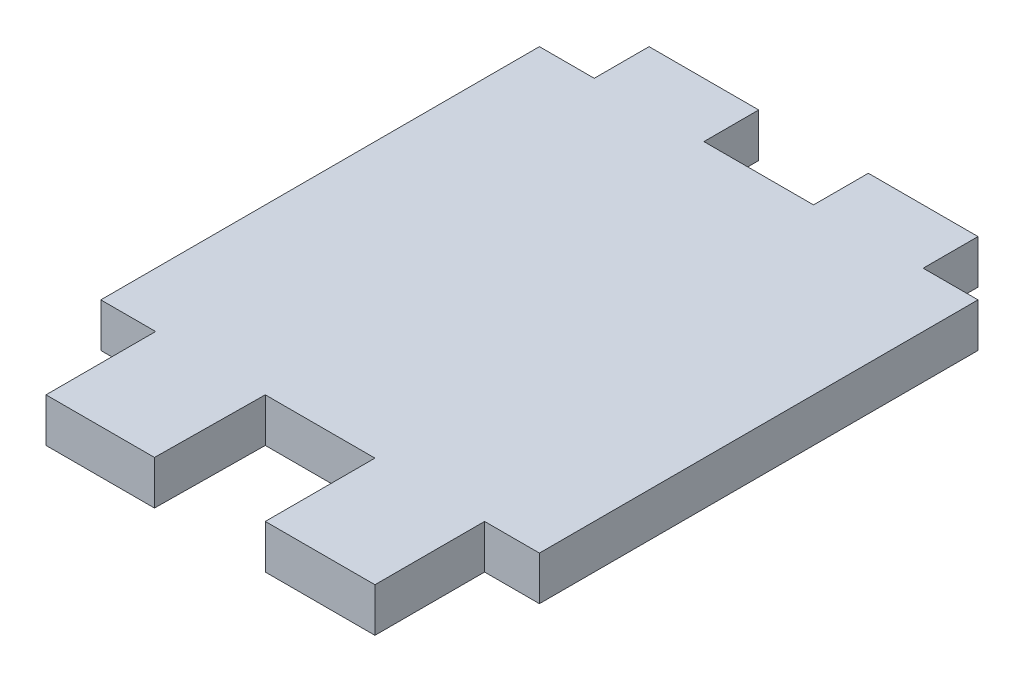
ISO-10303-21;
HEADER;
FILE_DESCRIPTION(('STEP AP214'),'2;1');
FILE_NAME('part.step','',(''),(''),'','','');
FILE_SCHEMA(('AUTOMOTIVE_DESIGN { 1 0 10303 214 1 1 1 1 }'));
ENDSEC;
DATA;
#1=APPLICATION_CONTEXT('core data for automotive mechanical design processes');
#2=APPLICATION_PROTOCOL_DEFINITION('international standard','automotive_design',2000,#1);
#3=PRODUCT_CONTEXT('',#1,'mechanical');
#4=PRODUCT('Part','Part','',(#3));
#5=PRODUCT_RELATED_PRODUCT_CATEGORY('part','',(#4));
#6=PRODUCT_DEFINITION_FORMATION('','',#4);
#7=PRODUCT_DEFINITION_CONTEXT('part definition',#1,'design');
#8=PRODUCT_DEFINITION('design','',#6,#7);
#9=PRODUCT_DEFINITION_SHAPE('','',#8);
#10=(LENGTH_UNIT() NAMED_UNIT(*) SI_UNIT(.MILLI.,.METRE.));
#11=(NAMED_UNIT(*) PLANE_ANGLE_UNIT() SI_UNIT($,.RADIAN.));
#12=(NAMED_UNIT(*) SI_UNIT($,.STERADIAN.) SOLID_ANGLE_UNIT());
#13=UNCERTAINTY_MEASURE_WITH_UNIT(LENGTH_MEASURE(1.E-05),#10,'distance_accuracy_value','');
#14=(GEOMETRIC_REPRESENTATION_CONTEXT(3) GLOBAL_UNCERTAINTY_ASSIGNED_CONTEXT((#13)) GLOBAL_UNIT_ASSIGNED_CONTEXT((#10,
#11,#12)) REPRESENTATION_CONTEXT('',''));
#15=CARTESIAN_POINT('',(0.,0.,0.));
#16=DIRECTION('',(0.,0.,1.));
#17=DIRECTION('',(1.,0.,0.));
#18=AXIS2_PLACEMENT_3D('',#15,#16,#17);
#19=CARTESIAN_POINT('',(0.533091410652587,4.,-30.5410125973874));
#20=DIRECTION('',(0.,0.,1.));
#21=DIRECTION('',(1.,0.,0.));
#22=AXIS2_PLACEMENT_3D('',#19,#20,#21);
#23=PLANE('',#22);
#24=DIRECTION('',(-1.,0.,0.));
#25=VECTOR('',#24,1.);
#26=CARTESIAN_POINT('',(0.533091410652587,0.,-30.5410125973874));
#27=LINE('',#26,#25);
#28=CARTESIAN_POINT('',(5.53309141065259,0.,-30.5410125973874));
#29=VERTEX_POINT('',#28);
#30=CARTESIAN_POINT('',(0.533091410652587,0.,-30.5410125973874));
#31=VERTEX_POINT('',#30);
#32=EDGE_CURVE('E200',#29,#31,#27,.T.);
#33=ORIENTED_EDGE('',*,*,#32,.T.);
#34=DIRECTION('',(0.,-1.,0.));
#35=VECTOR('',#34,1.);
#36=CARTESIAN_POINT('',(0.533091410652587,4.,-30.5410125973874));
#37=LINE('',#36,#35);
#38=CARTESIAN_POINT('',(0.533091410652587,4.,-30.5410125973874));
#39=VERTEX_POINT('',#38);
#40=EDGE_CURVE('E11',#39,#31,#37,.T.);
#41=ORIENTED_EDGE('',*,*,#40,.F.);
#42=DIRECTION('',(-1.,0.,0.));
#43=VECTOR('',#42,1.);
#44=CARTESIAN_POINT('',(0.533091410652587,4.,-30.5410125973874));
#45=LINE('',#44,#43);
#46=CARTESIAN_POINT('',(5.53309141065259,4.,-30.5410125973874));
#47=VERTEX_POINT('',#46);
#48=EDGE_CURVE('E238',#47,#39,#45,.T.);
#49=ORIENTED_EDGE('',*,*,#48,.F.);
#50=DIRECTION('',(0.,-1.,0.));
#51=VECTOR('',#50,1.);
#52=CARTESIAN_POINT('',(5.53309141065259,4.,-30.5410125973874));
#53=LINE('',#52,#51);
#54=EDGE_CURVE('E196',#47,#29,#53,.T.);
#55=ORIENTED_EDGE('',*,*,#54,.T.);
#56=EDGE_LOOP('',(#33,#41,#49,#55));
#57=FACE_BOUND('',#56,.T.);
#58=ADVANCED_FACE('F32',(#57),#23,.F.);
#59=CARTESIAN_POINT('',(0.533091410652587,4.,-30.5410125973874));
#60=DIRECTION('',(-1.,0.,0.));
#61=DIRECTION('',(0.,0.,1.));
#62=AXIS2_PLACEMENT_3D('',#59,#60,#61);
#63=PLANE('',#62);
#64=DIRECTION('',(0.,0.,-1.));
#65=VECTOR('',#64,1.);
#66=CARTESIAN_POINT('',(0.533091410652587,0.,-30.5410125973874));
#67=LINE('',#66,#65);
#68=CARTESIAN_POINT('',(0.533091410652587,0.,-35.5410125973874));
#69=VERTEX_POINT('',#68);
#70=EDGE_CURVE('E203',#31,#69,#67,.T.);
#71=ORIENTED_EDGE('',*,*,#70,.T.);
#72=DIRECTION('',(0.,-1.,0.));
#73=VECTOR('',#72,1.);
#74=CARTESIAN_POINT('',(0.533091410652587,4.,-35.5410125973874));
#75=LINE('',#74,#73);
#76=CARTESIAN_POINT('',(0.533091410652587,4.,-35.5410125973874));
#77=VERTEX_POINT('',#76);
#78=EDGE_CURVE('E40',#77,#69,#75,.T.);
#79=ORIENTED_EDGE('',*,*,#78,.F.);
#80=DIRECTION('',(0.,0.,-1.));
#81=VECTOR('',#80,1.);
#82=CARTESIAN_POINT('',(0.533091410652587,4.,-30.5410125973874));
#83=LINE('',#82,#81);
#84=EDGE_CURVE('E127',#39,#77,#83,.T.);
#85=ORIENTED_EDGE('',*,*,#84,.F.);
#86=ORIENTED_EDGE('',*,*,#40,.T.);
#87=EDGE_LOOP('',(#71,#79,#85,#86));
#88=FACE_BOUND('',#87,.T.);
#89=ADVANCED_FACE('F356',(#88),#63,.F.);
#90=CARTESIAN_POINT('',(0.533091410652587,4.,-35.5410125973874));
#91=DIRECTION('',(0.,0.,1.));
#92=DIRECTION('',(1.,0.,0.));
#93=AXIS2_PLACEMENT_3D('',#90,#91,#92);
#94=PLANE('',#93);
#95=DIRECTION('',(-1.,0.,0.));
#96=VECTOR('',#95,1.);
#97=CARTESIAN_POINT('',(0.533091410652587,0.,-35.5410125973874));
#98=LINE('',#97,#96);
#99=CARTESIAN_POINT('',(-9.46690858934741,0.,-35.5410125973874));
#100=VERTEX_POINT('',#99);
#101=EDGE_CURVE('E205',#69,#100,#98,.T.);
#102=ORIENTED_EDGE('',*,*,#101,.T.);
#103=DIRECTION('',(0.,-1.,0.));
#104=VECTOR('',#103,1.);
#105=CARTESIAN_POINT('',(-9.46690858934741,4.,-35.5410125973874));
#106=LINE('',#105,#104);
#107=CARTESIAN_POINT('',(-9.46690858934741,4.,-35.5410125973874));
#108=VERTEX_POINT('',#107);
#109=EDGE_CURVE('E281',#108,#100,#106,.T.);
#110=ORIENTED_EDGE('',*,*,#109,.F.);
#111=DIRECTION('',(-1.,0.,0.));
#112=VECTOR('',#111,1.);
#113=CARTESIAN_POINT('',(0.533091410652587,4.,-35.5410125973874));
#114=LINE('',#113,#112);
#115=EDGE_CURVE('E289',#77,#108,#114,.T.);
#116=ORIENTED_EDGE('',*,*,#115,.F.);
#117=ORIENTED_EDGE('',*,*,#78,.T.);
#118=EDGE_LOOP('',(#102,#110,#116,#117));
#119=FACE_BOUND('',#118,.T.);
#120=ADVANCED_FACE('F287',(#119),#94,.F.);
#121=CARTESIAN_POINT('',(-9.46690858934741,4.,-35.5410125973874));
#122=DIRECTION('',(1.,0.,0.));
#123=DIRECTION('',(0.,0.,-1.));
#124=AXIS2_PLACEMENT_3D('',#121,#122,#123);
#125=PLANE('',#124);
#126=DIRECTION('',(0.,0.,1.));
#127=VECTOR('',#126,1.);
#128=CARTESIAN_POINT('',(-9.46690858934741,0.,-35.5410125973874));
#129=LINE('',#128,#127);
#130=CARTESIAN_POINT('',(-9.46690858934741,0.,-30.5410125973874));
#131=VERTEX_POINT('',#130);
#132=EDGE_CURVE('E207',#100,#131,#129,.T.);
#133=ORIENTED_EDGE('',*,*,#132,.T.);
#134=DIRECTION('',(0.,-1.,0.));
#135=VECTOR('',#134,1.);
#136=CARTESIAN_POINT('',(-9.46690858934741,4.,-30.5410125973874));
#137=LINE('',#136,#135);
#138=CARTESIAN_POINT('',(-9.46690858934741,4.,-30.5410125973874));
#139=VERTEX_POINT('',#138);
#140=EDGE_CURVE('E278',#139,#131,#137,.T.);
#141=ORIENTED_EDGE('',*,*,#140,.F.);
#142=DIRECTION('',(0.,0.,1.));
#143=VECTOR('',#142,1.);
#144=CARTESIAN_POINT('',(-9.46690858934741,4.,-35.5410125973874));
#145=LINE('',#144,#143);
#146=EDGE_CURVE('E307',#108,#139,#145,.T.);
#147=ORIENTED_EDGE('',*,*,#146,.F.);
#148=ORIENTED_EDGE('',*,*,#109,.T.);
#149=EDGE_LOOP('',(#133,#141,#147,#148));
#150=FACE_BOUND('',#149,.T.);
#151=ADVANCED_FACE('F298',(#150),#125,.F.);
#152=CARTESIAN_POINT('',(-9.46690858934741,4.,-30.5410125973874));
#153=DIRECTION('',(0.,0.,1.));
#154=DIRECTION('',(1.,0.,0.));
#155=AXIS2_PLACEMENT_3D('',#152,#153,#154);
#156=PLANE('',#155);
#157=DIRECTION('',(-1.,0.,0.));
#158=VECTOR('',#157,1.);
#159=CARTESIAN_POINT('',(-9.46690858934741,0.,-30.5410125973874));
#160=LINE('',#159,#158);
#161=CARTESIAN_POINT('',(-19.4669085893474,0.,-30.5410125973874));
#162=VERTEX_POINT('',#161);
#163=EDGE_CURVE('E209',#131,#162,#160,.T.);
#164=ORIENTED_EDGE('',*,*,#163,.T.);
#165=DIRECTION('',(0.,-1.,0.));
#166=VECTOR('',#165,1.);
#167=CARTESIAN_POINT('',(-19.4669085893474,4.,-30.5410125973874));
#168=LINE('',#167,#166);
#169=CARTESIAN_POINT('',(-19.4669085893474,4.,-30.5410125973874));
#170=VERTEX_POINT('',#169);
#171=EDGE_CURVE('E275',#170,#162,#168,.T.);
#172=ORIENTED_EDGE('',*,*,#171,.F.);
#173=DIRECTION('',(-1.,0.,0.));
#174=VECTOR('',#173,1.);
#175=CARTESIAN_POINT('',(-9.46690858934741,4.,-30.5410125973874));
#176=LINE('',#175,#174);
#177=EDGE_CURVE('E304',#139,#170,#176,.T.);
#178=ORIENTED_EDGE('',*,*,#177,.F.);
#179=ORIENTED_EDGE('',*,*,#140,.T.);
#180=EDGE_LOOP('',(#164,#172,#178,#179));
#181=FACE_BOUND('',#180,.T.);
#182=ADVANCED_FACE('F302',(#181),#156,.F.);
#183=CARTESIAN_POINT('',(-19.4669085893474,4.,-30.5410125973874));
#184=DIRECTION('',(-1.,0.,0.));
#185=DIRECTION('',(0.,0.,1.));
#186=AXIS2_PLACEMENT_3D('',#183,#184,#185);
#187=PLANE('',#186);
#188=DIRECTION('',(0.,0.,-1.));
#189=VECTOR('',#188,1.);
#190=CARTESIAN_POINT('',(-19.4669085893474,0.,-30.5410125973874));
#191=LINE('',#190,#189);
#192=CARTESIAN_POINT('',(-19.4669085893474,0.,-35.5410125973874));
#193=VERTEX_POINT('',#192);
#194=EDGE_CURVE('E211',#162,#193,#191,.T.);
#195=ORIENTED_EDGE('',*,*,#194,.T.);
#196=DIRECTION('',(0.,-1.,0.));
#197=VECTOR('',#196,1.);
#198=CARTESIAN_POINT('',(-19.4669085893474,4.,-35.5410125973874));
#199=LINE('',#198,#197);
#200=CARTESIAN_POINT('',(-19.4669085893474,4.,-35.5410125973874));
#201=VERTEX_POINT('',#200);
#202=EDGE_CURVE('E272',#201,#193,#199,.T.);
#203=ORIENTED_EDGE('',*,*,#202,.F.);
#204=DIRECTION('',(0.,0.,-1.));
#205=VECTOR('',#204,1.);
#206=CARTESIAN_POINT('',(-19.4669085893474,4.,-30.5410125973874));
#207=LINE('',#206,#205);
#208=EDGE_CURVE('E306',#170,#201,#207,.T.);
#209=ORIENTED_EDGE('',*,*,#208,.F.);
#210=ORIENTED_EDGE('',*,*,#171,.T.);
#211=EDGE_LOOP('',(#195,#203,#209,#210));
#212=FACE_BOUND('',#211,.T.);
#213=ADVANCED_FACE('F369',(#212),#187,.F.);
#214=CARTESIAN_POINT('',(-19.4669085893474,4.,-35.5410125973874));
#215=DIRECTION('',(0.,0.,1.));
#216=DIRECTION('',(1.,0.,0.));
#217=AXIS2_PLACEMENT_3D('',#214,#215,#216);
#218=PLANE('',#217);
#219=DIRECTION('',(-1.,0.,0.));
#220=VECTOR('',#219,1.);
#221=CARTESIAN_POINT('',(-19.4669085893474,0.,-35.5410125973874));
#222=LINE('',#221,#220);
#223=CARTESIAN_POINT('',(-29.4669085893474,0.,-35.5410125973874));
#224=VERTEX_POINT('',#223);
#225=EDGE_CURVE('E213',#193,#224,#222,.T.);
#226=ORIENTED_EDGE('',*,*,#225,.T.);
#227=DIRECTION('',(0.,-1.,0.));
#228=VECTOR('',#227,1.);
#229=CARTESIAN_POINT('',(-29.4669085893474,4.,-35.5410125973874));
#230=LINE('',#229,#228);
#231=CARTESIAN_POINT('',(-29.4669085893474,4.,-35.5410125973874));
#232=VERTEX_POINT('',#231);
#233=EDGE_CURVE('E269',#232,#224,#230,.T.);
#234=ORIENTED_EDGE('',*,*,#233,.F.);
#235=DIRECTION('',(-1.,0.,0.));
#236=VECTOR('',#235,1.);
#237=CARTESIAN_POINT('',(-19.4669085893474,4.,-35.5410125973874));
#238=LINE('',#237,#236);
#239=EDGE_CURVE('E309',#201,#232,#238,.T.);
#240=ORIENTED_EDGE('',*,*,#239,.F.);
#241=ORIENTED_EDGE('',*,*,#202,.T.);
#242=EDGE_LOOP('',(#226,#234,#240,#241));
#243=FACE_BOUND('',#242,.T.);
#244=ADVANCED_FACE('F372',(#243),#218,.F.);
#245=CARTESIAN_POINT('',(-29.4669085893474,4.,-35.5410125973874));
#246=DIRECTION('',(1.,0.,0.));
#247=DIRECTION('',(0.,0.,-1.));
#248=AXIS2_PLACEMENT_3D('',#245,#246,#247);
#249=PLANE('',#248);
#250=DIRECTION('',(0.,0.,1.));
#251=VECTOR('',#250,1.);
#252=CARTESIAN_POINT('',(-29.4669085893474,0.,-35.5410125973874));
#253=LINE('',#252,#251);
#254=CARTESIAN_POINT('',(-29.4669085893474,0.,-30.5410125973874));
#255=VERTEX_POINT('',#254);
#256=EDGE_CURVE('E215',#224,#255,#253,.T.);
#257=ORIENTED_EDGE('',*,*,#256,.T.);
#258=DIRECTION('',(0.,-1.,0.));
#259=VECTOR('',#258,1.);
#260=CARTESIAN_POINT('',(-29.4669085893474,4.,-30.5410125973874));
#261=LINE('',#260,#259);
#262=CARTESIAN_POINT('',(-29.4669085893474,4.,-30.5410125973874));
#263=VERTEX_POINT('',#262);
#264=EDGE_CURVE('E266',#263,#255,#261,.T.);
#265=ORIENTED_EDGE('',*,*,#264,.F.);
#266=DIRECTION('',(0.,0.,1.));
#267=VECTOR('',#266,1.);
#268=CARTESIAN_POINT('',(-29.4669085893474,4.,-35.5410125973874));
#269=LINE('',#268,#267);
#270=EDGE_CURVE('E315',#232,#263,#269,.T.);
#271=ORIENTED_EDGE('',*,*,#270,.F.);
#272=ORIENTED_EDGE('',*,*,#233,.T.);
#273=EDGE_LOOP('',(#257,#265,#271,#272));
#274=FACE_BOUND('',#273,.T.);
#275=ADVANCED_FACE('F376',(#274),#249,.F.);
#276=CARTESIAN_POINT('',(-29.4669085893474,4.,-30.5410125973874));
#277=DIRECTION('',(0.,0.,1.));
#278=DIRECTION('',(1.,0.,0.));
#279=AXIS2_PLACEMENT_3D('',#276,#277,#278);
#280=PLANE('',#279);
#281=DIRECTION('',(-1.,0.,0.));
#282=VECTOR('',#281,1.);
#283=CARTESIAN_POINT('',(-29.4669085893474,0.,-30.5410125973874));
#284=LINE('',#283,#282);
#285=CARTESIAN_POINT('',(-34.4669085893474,0.,-30.5410125973874));
#286=VERTEX_POINT('',#285);
#287=EDGE_CURVE('E217',#255,#286,#284,.T.);
#288=ORIENTED_EDGE('',*,*,#287,.T.);
#289=DIRECTION('',(0.,-1.,0.));
#290=VECTOR('',#289,1.);
#291=CARTESIAN_POINT('',(-34.4669085893474,4.,-30.5410125973874));
#292=LINE('',#291,#290);
#293=CARTESIAN_POINT('',(-34.4669085893474,4.,-30.5410125973874));
#294=VERTEX_POINT('',#293);
#295=EDGE_CURVE('E263',#294,#286,#292,.T.);
#296=ORIENTED_EDGE('',*,*,#295,.F.);
#297=DIRECTION('',(-1.,0.,0.));
#298=VECTOR('',#297,1.);
#299=CARTESIAN_POINT('',(-29.4669085893474,4.,-30.5410125973874));
#300=LINE('',#299,#298);
#301=EDGE_CURVE('E317',#263,#294,#300,.T.);
#302=ORIENTED_EDGE('',*,*,#301,.F.);
#303=ORIENTED_EDGE('',*,*,#264,.T.);
#304=EDGE_LOOP('',(#288,#296,#302,#303));
#305=FACE_BOUND('',#304,.T.);
#306=ADVANCED_FACE('F380',(#305),#280,.F.);
#307=CARTESIAN_POINT('',(-34.4669085893474,4.,-30.5410125973874));
#308=DIRECTION('',(1.,0.,0.));
#309=DIRECTION('',(0.,0.,-1.));
#310=AXIS2_PLACEMENT_3D('',#307,#308,#309);
#311=PLANE('',#310);
#312=DIRECTION('',(0.,0.,1.));
#313=VECTOR('',#312,1.);
#314=CARTESIAN_POINT('',(-34.4669085893474,0.,-30.5410125973874));
#315=LINE('',#314,#313);
#316=CARTESIAN_POINT('',(-34.4669085893474,0.,9.45898740261258));
#317=VERTEX_POINT('',#316);
#318=EDGE_CURVE('E219',#286,#317,#315,.T.);
#319=ORIENTED_EDGE('',*,*,#318,.T.);
#320=DIRECTION('',(0.,-1.,0.));
#321=VECTOR('',#320,1.);
#322=CARTESIAN_POINT('',(-34.4669085893474,4.,9.45898740261258));
#323=LINE('',#322,#321);
#324=CARTESIAN_POINT('',(-34.4669085893474,4.,9.45898740261258));
#325=VERTEX_POINT('',#324);
#326=EDGE_CURVE('E260',#325,#317,#323,.T.);
#327=ORIENTED_EDGE('',*,*,#326,.F.);
#328=DIRECTION('',(0.,0.,1.));
#329=VECTOR('',#328,1.);
#330=CARTESIAN_POINT('',(-34.4669085893474,4.,-30.5410125973874));
#331=LINE('',#330,#329);
#332=EDGE_CURVE('E319',#294,#325,#331,.T.);
#333=ORIENTED_EDGE('',*,*,#332,.F.);
#334=ORIENTED_EDGE('',*,*,#295,.T.);
#335=EDGE_LOOP('',(#319,#327,#333,#334));
#336=FACE_BOUND('',#335,.T.);
#337=ADVANCED_FACE('F384',(#336),#311,.F.);
#338=CARTESIAN_POINT('',(-29.4669085893474,4.,9.45898740261258));
#339=DIRECTION('',(0.,0.,-1.));
#340=DIRECTION('',(-1.,0.,0.));
#341=AXIS2_PLACEMENT_3D('',#338,#339,#340);
#342=PLANE('',#341);
#343=DIRECTION('',(1.,0.,0.));
#344=VECTOR('',#343,1.);
#345=CARTESIAN_POINT('',(-29.4669085893474,0.,9.45898740261258));
#346=LINE('',#345,#344);
#347=CARTESIAN_POINT('',(-29.4669085893474,0.,9.45898740261258));
#348=VERTEX_POINT('',#347);
#349=EDGE_CURVE('E221',#317,#348,#346,.T.);
#350=ORIENTED_EDGE('',*,*,#349,.T.);
#351=DIRECTION('',(0.,-1.,0.));
#352=VECTOR('',#351,1.);
#353=CARTESIAN_POINT('',(-29.4669085893474,4.,9.45898740261258));
#354=LINE('',#353,#352);
#355=CARTESIAN_POINT('',(-29.4669085893474,4.,9.45898740261258));
#356=VERTEX_POINT('',#355);
#357=EDGE_CURVE('E257',#356,#348,#354,.T.);
#358=ORIENTED_EDGE('',*,*,#357,.F.);
#359=DIRECTION('',(1.,0.,0.));
#360=VECTOR('',#359,1.);
#361=CARTESIAN_POINT('',(-29.4669085893474,4.,9.45898740261258));
#362=LINE('',#361,#360);
#363=EDGE_CURVE('E321',#325,#356,#362,.T.);
#364=ORIENTED_EDGE('',*,*,#363,.F.);
#365=ORIENTED_EDGE('',*,*,#326,.T.);
#366=EDGE_LOOP('',(#350,#358,#364,#365));
#367=FACE_BOUND('',#366,.T.);
#368=ADVANCED_FACE('F388',(#367),#342,.F.);
#369=CARTESIAN_POINT('',(-29.4669085893474,4.,19.4589874026126));
#370=DIRECTION('',(1.,0.,0.));
#371=DIRECTION('',(0.,0.,-1.));
#372=AXIS2_PLACEMENT_3D('',#369,#370,#371);
#373=PLANE('',#372);
#374=DIRECTION('',(0.,0.,1.));
#375=VECTOR('',#374,1.);
#376=CARTESIAN_POINT('',(-29.4669085893474,0.,19.4589874026126));
#377=LINE('',#376,#375);
#378=CARTESIAN_POINT('',(-29.4669085893474,0.,19.4589874026126));
#379=VERTEX_POINT('',#378);
#380=EDGE_CURVE('E223',#348,#379,#377,.T.);
#381=ORIENTED_EDGE('',*,*,#380,.T.);
#382=DIRECTION('',(0.,-1.,0.));
#383=VECTOR('',#382,1.);
#384=CARTESIAN_POINT('',(-29.4669085893474,4.,19.4589874026126));
#385=LINE('',#384,#383);
#386=CARTESIAN_POINT('',(-29.4669085893474,4.,19.4589874026126));
#387=VERTEX_POINT('',#386);
#388=EDGE_CURVE('E254',#387,#379,#385,.T.);
#389=ORIENTED_EDGE('',*,*,#388,.F.);
#390=DIRECTION('',(0.,0.,1.));
#391=VECTOR('',#390,1.);
#392=CARTESIAN_POINT('',(-29.4669085893474,4.,19.4589874026126));
#393=LINE('',#392,#391);
#394=EDGE_CURVE('E323',#356,#387,#393,.T.);
#395=ORIENTED_EDGE('',*,*,#394,.F.);
#396=ORIENTED_EDGE('',*,*,#357,.T.);
#397=EDGE_LOOP('',(#381,#389,#395,#396));
#398=FACE_BOUND('',#397,.T.);
#399=ADVANCED_FACE('F392',(#398),#373,.F.);
#400=CARTESIAN_POINT('',(-19.5742645583764,4.,19.4589874026126));
#401=DIRECTION('',(0.,0.,-1.));
#402=DIRECTION('',(-1.,0.,0.));
#403=AXIS2_PLACEMENT_3D('',#400,#401,#402);
#404=PLANE('',#403);
#405=DIRECTION('',(1.,0.,0.));
#406=VECTOR('',#405,1.);
#407=CARTESIAN_POINT('',(-19.5742645583764,0.,19.4589874026126));
#408=LINE('',#407,#406);
#409=CARTESIAN_POINT('',(-19.5742645583764,0.,19.4589874026126));
#410=VERTEX_POINT('',#409);
#411=EDGE_CURVE('E225',#379,#410,#408,.T.);
#412=ORIENTED_EDGE('',*,*,#411,.T.);
#413=DIRECTION('',(0.,-1.,0.));
#414=VECTOR('',#413,1.);
#415=CARTESIAN_POINT('',(-19.5742645583764,4.,19.4589874026126));
#416=LINE('',#415,#414);
#417=CARTESIAN_POINT('',(-19.5742645583764,4.,19.4589874026126));
#418=VERTEX_POINT('',#417);
#419=EDGE_CURVE('E251',#418,#410,#416,.T.);
#420=ORIENTED_EDGE('',*,*,#419,.F.);
#421=DIRECTION('',(1.,0.,0.));
#422=VECTOR('',#421,1.);
#423=CARTESIAN_POINT('',(-19.5742645583764,4.,19.4589874026126));
#424=LINE('',#423,#422);
#425=EDGE_CURVE('E325',#387,#418,#424,.T.);
#426=ORIENTED_EDGE('',*,*,#425,.F.);
#427=ORIENTED_EDGE('',*,*,#388,.T.);
#428=EDGE_LOOP('',(#412,#420,#426,#427));
#429=FACE_BOUND('',#428,.T.);
#430=ADVANCED_FACE('F396',(#429),#404,.F.);
#431=CARTESIAN_POINT('',(-19.4669085893474,4.,9.45898740261259));
#432=DIRECTION('',(-0.999942378460315,0.,-0.0107349783012724));
#433=DIRECTION('',(-0.0107349783012724,0.,0.999942378460315));
#434=AXIS2_PLACEMENT_3D('',#431,#432,#433);
#435=PLANE('',#434);
#436=DIRECTION('',(0.0107349783012724,0.,-0.999942378460315));
#437=VECTOR('',#436,1.);
#438=CARTESIAN_POINT('',(-19.4669085893474,0.,9.45898740261259));
#439=LINE('',#438,#437);
#440=CARTESIAN_POINT('',(-19.4669085893474,0.,9.45898740261259));
#441=VERTEX_POINT('',#440);
#442=EDGE_CURVE('E227',#410,#441,#439,.T.);
#443=ORIENTED_EDGE('',*,*,#442,.T.);
#444=DIRECTION('',(0.,-1.,0.));
#445=VECTOR('',#444,1.);
#446=CARTESIAN_POINT('',(-19.4669085893474,4.,9.45898740261259));
#447=LINE('',#446,#445);
#448=CARTESIAN_POINT('',(-19.4669085893474,4.,9.45898740261259));
#449=VERTEX_POINT('',#448);
#450=EDGE_CURVE('E248',#449,#441,#447,.T.);
#451=ORIENTED_EDGE('',*,*,#450,.F.);
#452=DIRECTION('',(0.0107349783012724,0.,-0.999942378460315));
#453=VECTOR('',#452,1.);
#454=CARTESIAN_POINT('',(-19.4669085893474,4.,9.45898740261259));
#455=LINE('',#454,#453);
#456=EDGE_CURVE('E327',#418,#449,#455,.T.);
#457=ORIENTED_EDGE('',*,*,#456,.F.);
#458=ORIENTED_EDGE('',*,*,#419,.T.);
#459=EDGE_LOOP('',(#443,#451,#457,#458));
#460=FACE_BOUND('',#459,.T.);
#461=ADVANCED_FACE('F400',(#460),#435,.F.);
#462=CARTESIAN_POINT('',(-9.46690858934741,4.,9.45898740261259));
#463=DIRECTION('',(0.,0.,-1.));
#464=DIRECTION('',(-1.,0.,0.));
#465=AXIS2_PLACEMENT_3D('',#462,#463,#464);
#466=PLANE('',#465);
#467=DIRECTION('',(1.,0.,0.));
#468=VECTOR('',#467,1.);
#469=CARTESIAN_POINT('',(-9.46690858934741,0.,9.45898740261259));
#470=LINE('',#469,#468);
#471=CARTESIAN_POINT('',(-9.46690858934741,0.,9.45898740261259));
#472=VERTEX_POINT('',#471);
#473=EDGE_CURVE('E229',#441,#472,#470,.T.);
#474=ORIENTED_EDGE('',*,*,#473,.T.);
#475=DIRECTION('',(0.,-1.,0.));
#476=VECTOR('',#475,1.);
#477=CARTESIAN_POINT('',(-9.46690858934741,4.,9.45898740261259));
#478=LINE('',#477,#476);
#479=CARTESIAN_POINT('',(-9.46690858934741,4.,9.45898740261259));
#480=VERTEX_POINT('',#479);
#481=EDGE_CURVE('E245',#480,#472,#478,.T.);
#482=ORIENTED_EDGE('',*,*,#481,.F.);
#483=DIRECTION('',(1.,0.,0.));
#484=VECTOR('',#483,1.);
#485=CARTESIAN_POINT('',(-9.46690858934741,4.,9.45898740261259));
#486=LINE('',#485,#484);
#487=EDGE_CURVE('E329',#449,#480,#486,.T.);
#488=ORIENTED_EDGE('',*,*,#487,.F.);
#489=ORIENTED_EDGE('',*,*,#450,.T.);
#490=EDGE_LOOP('',(#474,#482,#488,#489));
#491=FACE_BOUND('',#490,.T.);
#492=ADVANCED_FACE('F404',(#491),#466,.F.);
#493=CARTESIAN_POINT('',(-9.46690858934741,4.,19.4589874026126));
#494=DIRECTION('',(1.,0.,0.));
#495=DIRECTION('',(0.,0.,-1.));
#496=AXIS2_PLACEMENT_3D('',#493,#494,#495);
#497=PLANE('',#496);
#498=DIRECTION('',(0.,0.,1.));
#499=VECTOR('',#498,1.);
#500=CARTESIAN_POINT('',(-9.46690858934741,0.,19.4589874026126));
#501=LINE('',#500,#499);
#502=CARTESIAN_POINT('',(-9.46690858934741,0.,19.4589874026126));
#503=VERTEX_POINT('',#502);
#504=EDGE_CURVE('E231',#472,#503,#501,.T.);
#505=ORIENTED_EDGE('',*,*,#504,.T.);
#506=DIRECTION('',(0.,-1.,0.));
#507=VECTOR('',#506,1.);
#508=CARTESIAN_POINT('',(-9.46690858934741,4.,19.4589874026126));
#509=LINE('',#508,#507);
#510=CARTESIAN_POINT('',(-9.46690858934741,4.,19.4589874026126));
#511=VERTEX_POINT('',#510);
#512=EDGE_CURVE('E242',#511,#503,#509,.T.);
#513=ORIENTED_EDGE('',*,*,#512,.F.);
#514=DIRECTION('',(0.,0.,1.));
#515=VECTOR('',#514,1.);
#516=CARTESIAN_POINT('',(-9.46690858934741,4.,19.4589874026126));
#517=LINE('',#516,#515);
#518=EDGE_CURVE('E331',#480,#511,#517,.T.);
#519=ORIENTED_EDGE('',*,*,#518,.F.);
#520=ORIENTED_EDGE('',*,*,#481,.T.);
#521=EDGE_LOOP('',(#505,#513,#519,#520));
#522=FACE_BOUND('',#521,.T.);
#523=ADVANCED_FACE('F337',(#522),#497,.F.);
#524=CARTESIAN_POINT('',(0.533091410652587,4.,19.4589874026126));
#525=DIRECTION('',(0.,0.,-1.));
#526=DIRECTION('',(-1.,0.,0.));
#527=AXIS2_PLACEMENT_3D('',#524,#525,#526);
#528=PLANE('',#527);
#529=DIRECTION('',(1.,0.,0.));
#530=VECTOR('',#529,1.);
#531=CARTESIAN_POINT('',(0.533091410652587,0.,19.4589874026126));
#532=LINE('',#531,#530);
#533=CARTESIAN_POINT('',(0.533091410652587,0.,19.4589874026126));
#534=VERTEX_POINT('',#533);
#535=EDGE_CURVE('E233',#503,#534,#532,.T.);
#536=ORIENTED_EDGE('',*,*,#535,.T.);
#537=DIRECTION('',(0.,-1.,0.));
#538=VECTOR('',#537,1.);
#539=CARTESIAN_POINT('',(0.533091410652587,4.,19.4589874026126));
#540=LINE('',#539,#538);
#541=CARTESIAN_POINT('',(0.533091410652587,4.,19.4589874026126));
#542=VERTEX_POINT('',#541);
#543=EDGE_CURVE('E191',#542,#534,#540,.T.);
#544=ORIENTED_EDGE('',*,*,#543,.F.);
#545=DIRECTION('',(1.,0.,0.));
#546=VECTOR('',#545,1.);
#547=CARTESIAN_POINT('',(0.533091410652587,4.,19.4589874026126));
#548=LINE('',#547,#546);
#549=EDGE_CURVE('E182',#511,#542,#548,.T.);
#550=ORIENTED_EDGE('',*,*,#549,.F.);
#551=ORIENTED_EDGE('',*,*,#512,.T.);
#552=EDGE_LOOP('',(#536,#544,#550,#551));
#553=FACE_BOUND('',#552,.T.);
#554=ADVANCED_FACE('F341',(#553),#528,.F.);
#555=CARTESIAN_POINT('',(0.533091410652587,4.,9.45898740261259));
#556=DIRECTION('',(-1.,0.,0.));
#557=DIRECTION('',(0.,0.,1.));
#558=AXIS2_PLACEMENT_3D('',#555,#556,#557);
#559=PLANE('',#558);
#560=DIRECTION('',(0.,0.,-1.));
#561=VECTOR('',#560,1.);
#562=CARTESIAN_POINT('',(0.533091410652587,0.,9.45898740261259));
#563=LINE('',#562,#561);
#564=CARTESIAN_POINT('',(0.533091410652587,0.,9.45898740261259));
#565=VERTEX_POINT('',#564);
#566=EDGE_CURVE('E190',#534,#565,#563,.T.);
#567=ORIENTED_EDGE('',*,*,#566,.T.);
#568=DIRECTION('',(0.,-1.,0.));
#569=VECTOR('',#568,1.);
#570=CARTESIAN_POINT('',(0.533091410652587,4.,9.45898740261259));
#571=LINE('',#570,#569);
#572=CARTESIAN_POINT('',(0.533091410652587,4.,9.45898740261259));
#573=VERTEX_POINT('',#572);
#574=EDGE_CURVE('E187',#573,#565,#571,.T.);
#575=ORIENTED_EDGE('',*,*,#574,.F.);
#576=DIRECTION('',(0.,0.,-1.));
#577=VECTOR('',#576,1.);
#578=CARTESIAN_POINT('',(0.533091410652587,4.,9.45898740261259));
#579=LINE('',#578,#577);
#580=EDGE_CURVE('E176',#542,#573,#579,.T.);
#581=ORIENTED_EDGE('',*,*,#580,.F.);
#582=ORIENTED_EDGE('',*,*,#543,.T.);
#583=EDGE_LOOP('',(#567,#575,#581,#582));
#584=FACE_BOUND('',#583,.T.);
#585=ADVANCED_FACE('F188',(#584),#559,.F.);
#586=CARTESIAN_POINT('',(5.5330914106526,4.,9.45898740261258));
#587=DIRECTION('',(0.,0.,-1.));
#588=DIRECTION('',(-1.,0.,0.));
#589=AXIS2_PLACEMENT_3D('',#586,#587,#588);
#590=PLANE('',#589);
#591=DIRECTION('',(1.,0.,0.));
#592=VECTOR('',#591,1.);
#593=CARTESIAN_POINT('',(5.5330914106526,0.,9.45898740261258));
#594=LINE('',#593,#592);
#595=CARTESIAN_POINT('',(5.5330914106526,0.,9.45898740261258));
#596=VERTEX_POINT('',#595);
#597=EDGE_CURVE('E113',#565,#596,#594,.T.);
#598=ORIENTED_EDGE('',*,*,#597,.T.);
#599=DIRECTION('',(0.,-1.,0.));
#600=VECTOR('',#599,1.);
#601=CARTESIAN_POINT('',(5.5330914106526,4.,9.45898740261258));
#602=LINE('',#601,#600);
#603=CARTESIAN_POINT('',(5.5330914106526,4.,9.45898740261258));
#604=VERTEX_POINT('',#603);
#605=EDGE_CURVE('E192',#604,#596,#602,.T.);
#606=ORIENTED_EDGE('',*,*,#605,.F.);
#607=DIRECTION('',(1.,0.,0.));
#608=VECTOR('',#607,1.);
#609=CARTESIAN_POINT('',(5.5330914106526,4.,9.45898740261258));
#610=LINE('',#609,#608);
#611=EDGE_CURVE('E180',#573,#604,#610,.T.);
#612=ORIENTED_EDGE('',*,*,#611,.F.);
#613=ORIENTED_EDGE('',*,*,#574,.T.);
#614=EDGE_LOOP('',(#598,#606,#612,#613));
#615=FACE_BOUND('',#614,.T.);
#616=ADVANCED_FACE('F194',(#615),#590,.F.);
#617=CARTESIAN_POINT('',(5.53309141065259,4.,-30.5410125973874));
#618=DIRECTION('',(-1.,0.,0.));
#619=DIRECTION('',(0.,0.,1.));
#620=AXIS2_PLACEMENT_3D('',#617,#618,#619);
#621=PLANE('',#620);
#622=DIRECTION('',(0.,0.,-1.));
#623=VECTOR('',#622,1.);
#624=CARTESIAN_POINT('',(5.53309141065259,0.,-30.5410125973874));
#625=LINE('',#624,#623);
#626=EDGE_CURVE('E119',#596,#29,#625,.T.);
#627=ORIENTED_EDGE('',*,*,#626,.T.);
#628=ORIENTED_EDGE('',*,*,#54,.F.);
#629=DIRECTION('',(0.,0.,-1.));
#630=VECTOR('',#629,1.);
#631=CARTESIAN_POINT('',(5.53309141065259,4.,-30.5410125973874));
#632=LINE('',#631,#630);
#633=EDGE_CURVE('E48',#604,#47,#632,.T.);
#634=ORIENTED_EDGE('',*,*,#633,.F.);
#635=ORIENTED_EDGE('',*,*,#605,.T.);
#636=EDGE_LOOP('',(#627,#628,#634,#635));
#637=FACE_BOUND('',#636,.T.);
#638=ADVANCED_FACE('F345',(#637),#621,.F.);
#639=CARTESIAN_POINT('',(0.,4.,0.));
#640=DIRECTION('',(0.,-1.,0.));
#641=DIRECTION('',(0.,0.,-1.));
#642=AXIS2_PLACEMENT_3D('',#639,#640,#641);
#643=PLANE('',#642);
#644=ORIENTED_EDGE('',*,*,#48,.T.);
#645=ORIENTED_EDGE('',*,*,#84,.T.);
#646=ORIENTED_EDGE('',*,*,#115,.T.);
#647=ORIENTED_EDGE('',*,*,#146,.T.);
#648=ORIENTED_EDGE('',*,*,#177,.T.);
#649=ORIENTED_EDGE('',*,*,#208,.T.);
#650=ORIENTED_EDGE('',*,*,#239,.T.);
#651=ORIENTED_EDGE('',*,*,#270,.T.);
#652=ORIENTED_EDGE('',*,*,#301,.T.);
#653=ORIENTED_EDGE('',*,*,#332,.T.);
#654=ORIENTED_EDGE('',*,*,#363,.T.);
#655=ORIENTED_EDGE('',*,*,#394,.T.);
#656=ORIENTED_EDGE('',*,*,#425,.T.);
#657=ORIENTED_EDGE('',*,*,#456,.T.);
#658=ORIENTED_EDGE('',*,*,#487,.T.);
#659=ORIENTED_EDGE('',*,*,#518,.T.);
#660=ORIENTED_EDGE('',*,*,#549,.T.);
#661=ORIENTED_EDGE('',*,*,#580,.T.);
#662=ORIENTED_EDGE('',*,*,#611,.T.);
#663=ORIENTED_EDGE('',*,*,#633,.T.);
#664=EDGE_LOOP('',(#644,#645,#646,#647,#648,#649,#650,#651,#652,#653,#654,#655,#656,#657,#658,
#659,#660,#661,#662,#663));
#665=FACE_BOUND('',#664,.T.);
#666=ADVANCED_FACE('F178',(#665),#643,.F.);
#667=CARTESIAN_POINT('',(0.,0.,0.));
#668=DIRECTION('',(0.,-1.,0.));
#669=DIRECTION('',(0.,0.,-1.));
#670=AXIS2_PLACEMENT_3D('',#667,#668,#669);
#671=PLANE('',#670);
#672=ORIENTED_EDGE('',*,*,#32,.F.);
#673=ORIENTED_EDGE('',*,*,#626,.F.);
#674=ORIENTED_EDGE('',*,*,#597,.F.);
#675=ORIENTED_EDGE('',*,*,#566,.F.);
#676=ORIENTED_EDGE('',*,*,#535,.F.);
#677=ORIENTED_EDGE('',*,*,#504,.F.);
#678=ORIENTED_EDGE('',*,*,#473,.F.);
#679=ORIENTED_EDGE('',*,*,#442,.F.);
#680=ORIENTED_EDGE('',*,*,#411,.F.);
#681=ORIENTED_EDGE('',*,*,#380,.F.);
#682=ORIENTED_EDGE('',*,*,#349,.F.);
#683=ORIENTED_EDGE('',*,*,#318,.F.);
#684=ORIENTED_EDGE('',*,*,#287,.F.);
#685=ORIENTED_EDGE('',*,*,#256,.F.);
#686=ORIENTED_EDGE('',*,*,#225,.F.);
#687=ORIENTED_EDGE('',*,*,#194,.F.);
#688=ORIENTED_EDGE('',*,*,#163,.F.);
#689=ORIENTED_EDGE('',*,*,#132,.F.);
#690=ORIENTED_EDGE('',*,*,#101,.F.);
#691=ORIENTED_EDGE('',*,*,#70,.F.);
#692=EDGE_LOOP('',(#672,#673,#674,#675,#676,#677,#678,#679,#680,#681,#682,#683,#684,#685,#686,
#687,#688,#689,#690,#691));
#693=FACE_BOUND('',#692,.T.);
#694=ADVANCED_FACE('F293',(#693),#671,.T.);
#695=CLOSED_SHELL('',(#58,#89,#120,#151,#182,#213,#244,#275,#306,#337,#368,#399,#430,#461,#492,
#523,#554,#585,#616,#638,#666,#694));
#696=MANIFOLD_SOLID_BREP('B2',#695);
#697=ADVANCED_BREP_SHAPE_REPRESENTATION('',(#18,#696),#14);
#698=SHAPE_DEFINITION_REPRESENTATION(#9,#697);
ENDSEC;
END-ISO-10303-21;
